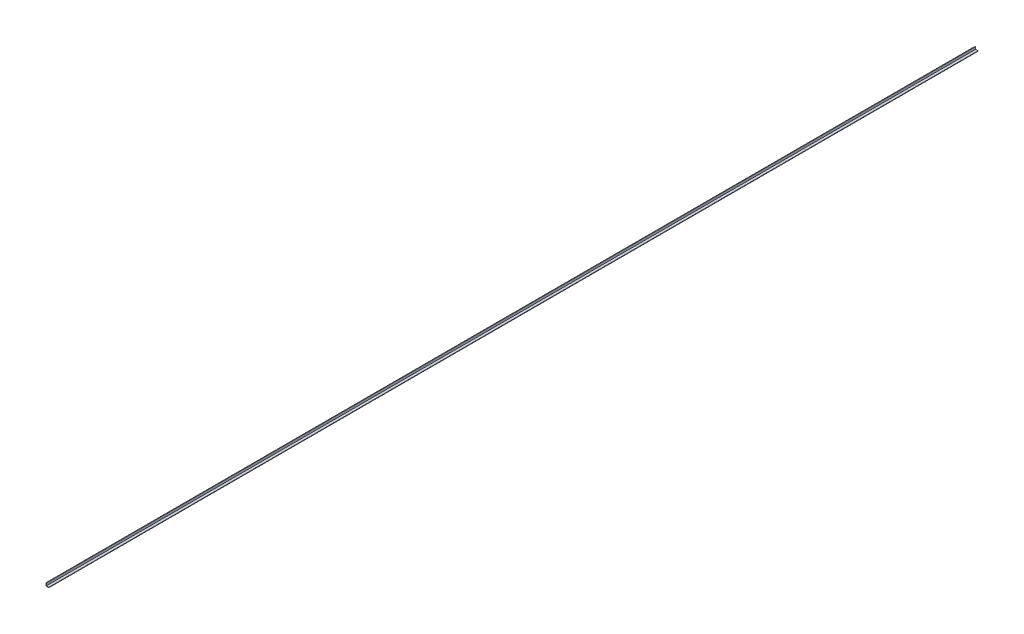
ISO-10303-21;
HEADER;
FILE_DESCRIPTION(('STEP AP214'),'2;1');
FILE_NAME('part.step','',(''),(''),'','','');
FILE_SCHEMA(('AUTOMOTIVE_DESIGN { 1 0 10303 214 1 1 1 1 }'));
ENDSEC;
DATA;
#1=APPLICATION_CONTEXT('core data for automotive mechanical design processes');
#2=APPLICATION_PROTOCOL_DEFINITION('international standard','automotive_design',2000,#1);
#3=PRODUCT_CONTEXT('',#1,'mechanical');
#4=PRODUCT('Part','Part','',(#3));
#5=PRODUCT_RELATED_PRODUCT_CATEGORY('part','',(#4));
#6=PRODUCT_DEFINITION_FORMATION('','',#4);
#7=PRODUCT_DEFINITION_CONTEXT('part definition',#1,'design');
#8=PRODUCT_DEFINITION('design','',#6,#7);
#9=PRODUCT_DEFINITION_SHAPE('','',#8);
#10=(LENGTH_UNIT() NAMED_UNIT(*) SI_UNIT(.MILLI.,.METRE.));
#11=(NAMED_UNIT(*) PLANE_ANGLE_UNIT() SI_UNIT($,.RADIAN.));
#12=(NAMED_UNIT(*) SI_UNIT($,.STERADIAN.) SOLID_ANGLE_UNIT());
#13=UNCERTAINTY_MEASURE_WITH_UNIT(LENGTH_MEASURE(1.E-05),#10,'distance_accuracy_value','');
#14=(GEOMETRIC_REPRESENTATION_CONTEXT(3) GLOBAL_UNCERTAINTY_ASSIGNED_CONTEXT((#13)) GLOBAL_UNIT_ASSIGNED_CONTEXT((#10,
#11,#12)) REPRESENTATION_CONTEXT('',''));
#15=CARTESIAN_POINT('',(0.,0.,0.));
#16=DIRECTION('',(0.,0.,1.));
#17=DIRECTION('',(1.,0.,0.));
#18=AXIS2_PLACEMENT_3D('',#15,#16,#17);
#19=CARTESIAN_POINT('',(3.18,19.05,-6100.));
#20=DIRECTION('',(0.,1.,0.));
#21=DIRECTION('',(0.,0.,1.));
#22=AXIS2_PLACEMENT_3D('',#19,#20,#21);
#23=PLANE('',#22);
#24=DIRECTION('',(-1.,0.,0.));
#25=VECTOR('',#24,1.);
#26=CARTESIAN_POINT('',(3.18,19.05,0.));
#27=LINE('',#26,#25);
#28=CARTESIAN_POINT('',(3.18,19.05,0.));
#29=VERTEX_POINT('',#28);
#30=CARTESIAN_POINT('',(0.,19.05,0.));
#31=VERTEX_POINT('',#30);
#32=EDGE_CURVE('E118',#29,#31,#27,.T.);
#33=ORIENTED_EDGE('',*,*,#32,.F.);
#34=DIRECTION('',(0.,0.,1.));
#35=VECTOR('',#34,1.);
#36=CARTESIAN_POINT('',(3.18,19.05,-6100.));
#37=LINE('',#36,#35);
#38=CARTESIAN_POINT('',(3.18,19.05,-6100.));
#39=VERTEX_POINT('',#38);
#40=EDGE_CURVE('E11',#39,#29,#37,.T.);
#41=ORIENTED_EDGE('',*,*,#40,.F.);
#42=DIRECTION('',(-1.,0.,0.));
#43=VECTOR('',#42,1.);
#44=CARTESIAN_POINT('',(3.18,19.05,-6100.));
#45=LINE('',#44,#43);
#46=CARTESIAN_POINT('',(0.,19.05,-6100.));
#47=VERTEX_POINT('',#46);
#48=EDGE_CURVE('E132',#39,#47,#45,.T.);
#49=ORIENTED_EDGE('',*,*,#48,.T.);
#50=DIRECTION('',(0.,0.,1.));
#51=VECTOR('',#50,1.);
#52=CARTESIAN_POINT('',(0.,19.05,-6100.));
#53=LINE('',#52,#51);
#54=EDGE_CURVE('E36',#47,#31,#53,.T.);
#55=ORIENTED_EDGE('',*,*,#54,.T.);
#56=EDGE_LOOP('',(#33,#41,#49,#55));
#57=FACE_BOUND('',#56,.T.);
#58=ADVANCED_FACE('F33',(#57),#23,.T.);
#59=CARTESIAN_POINT('',(3.18,3.18,-6100.));
#60=DIRECTION('',(1.,0.,0.));
#61=DIRECTION('',(0.,0.,-1.));
#62=AXIS2_PLACEMENT_3D('',#59,#60,#61);
#63=PLANE('',#62);
#64=DIRECTION('',(0.,1.,0.));
#65=VECTOR('',#64,1.);
#66=CARTESIAN_POINT('',(3.18,3.18,0.));
#67=LINE('',#66,#65);
#68=CARTESIAN_POINT('',(3.18,3.18,0.));
#69=VERTEX_POINT('',#68);
#70=EDGE_CURVE('E130',#69,#29,#67,.T.);
#71=ORIENTED_EDGE('',*,*,#70,.F.);
#72=DIRECTION('',(0.,0.,1.));
#73=VECTOR('',#72,1.);
#74=CARTESIAN_POINT('',(3.18,3.18,-6100.));
#75=LINE('',#74,#73);
#76=CARTESIAN_POINT('',(3.18,3.18,-6100.));
#77=VERTEX_POINT('',#76);
#78=EDGE_CURVE('E42',#77,#69,#75,.T.);
#79=ORIENTED_EDGE('',*,*,#78,.F.);
#80=DIRECTION('',(0.,1.,0.));
#81=VECTOR('',#80,1.);
#82=CARTESIAN_POINT('',(3.18,3.18,-6100.));
#83=LINE('',#82,#81);
#84=EDGE_CURVE('E108',#77,#39,#83,.T.);
#85=ORIENTED_EDGE('',*,*,#84,.T.);
#86=ORIENTED_EDGE('',*,*,#40,.T.);
#87=EDGE_LOOP('',(#71,#79,#85,#86));
#88=FACE_BOUND('',#87,.T.);
#89=ADVANCED_FACE('F140',(#88),#63,.T.);
#90=CARTESIAN_POINT('',(19.05,3.18,-6100.));
#91=DIRECTION('',(0.,1.,0.));
#92=DIRECTION('',(-1.,0.,0.));
#93=AXIS2_PLACEMENT_3D('',#90,#91,#92);
#94=PLANE('',#93);
#95=DIRECTION('',(-1.,0.,0.));
#96=VECTOR('',#95,1.);
#97=CARTESIAN_POINT('',(19.05,3.18,0.));
#98=LINE('',#97,#96);
#99=CARTESIAN_POINT('',(19.05,3.18,0.));
#100=VERTEX_POINT('',#99);
#101=EDGE_CURVE('E95',#100,#69,#98,.T.);
#102=ORIENTED_EDGE('',*,*,#101,.F.);
#103=DIRECTION('',(0.,0.,1.));
#104=VECTOR('',#103,1.);
#105=CARTESIAN_POINT('',(19.05,3.18,-6100.));
#106=LINE('',#105,#104);
#107=CARTESIAN_POINT('',(19.05,3.18,-6100.));
#108=VERTEX_POINT('',#107);
#109=EDGE_CURVE('E90',#108,#100,#106,.T.);
#110=ORIENTED_EDGE('',*,*,#109,.F.);
#111=DIRECTION('',(-1.,0.,0.));
#112=VECTOR('',#111,1.);
#113=CARTESIAN_POINT('',(19.05,3.18,-6100.));
#114=LINE('',#113,#112);
#115=EDGE_CURVE('E93',#108,#77,#114,.T.);
#116=ORIENTED_EDGE('',*,*,#115,.T.);
#117=ORIENTED_EDGE('',*,*,#78,.T.);
#118=EDGE_LOOP('',(#102,#110,#116,#117));
#119=FACE_BOUND('',#118,.T.);
#120=ADVANCED_FACE('F92',(#119),#94,.T.);
#121=CARTESIAN_POINT('',(19.05,0.,-6100.));
#122=DIRECTION('',(1.,0.,0.));
#123=DIRECTION('',(0.,0.,-1.));
#124=AXIS2_PLACEMENT_3D('',#121,#122,#123);
#125=PLANE('',#124);
#126=DIRECTION('',(0.,1.,0.));
#127=VECTOR('',#126,1.);
#128=CARTESIAN_POINT('',(19.05,0.,0.));
#129=LINE('',#128,#127);
#130=CARTESIAN_POINT('',(19.05,0.,0.));
#131=VERTEX_POINT('',#130);
#132=EDGE_CURVE('E127',#131,#100,#129,.T.);
#133=ORIENTED_EDGE('',*,*,#132,.F.);
#134=DIRECTION('',(0.,0.,1.));
#135=VECTOR('',#134,1.);
#136=CARTESIAN_POINT('',(19.05,0.,-6100.));
#137=LINE('',#136,#135);
#138=CARTESIAN_POINT('',(19.05,0.,-6100.));
#139=VERTEX_POINT('',#138);
#140=EDGE_CURVE('E100',#139,#131,#137,.T.);
#141=ORIENTED_EDGE('',*,*,#140,.F.);
#142=DIRECTION('',(0.,1.,0.));
#143=VECTOR('',#142,1.);
#144=CARTESIAN_POINT('',(19.05,0.,-6100.));
#145=LINE('',#144,#143);
#146=EDGE_CURVE('E106',#139,#108,#145,.T.);
#147=ORIENTED_EDGE('',*,*,#146,.T.);
#148=ORIENTED_EDGE('',*,*,#109,.T.);
#149=EDGE_LOOP('',(#133,#141,#147,#148));
#150=FACE_BOUND('',#149,.T.);
#151=ADVANCED_FACE('F110',(#150),#125,.T.);
#152=CARTESIAN_POINT('',(0.,0.,-6100.));
#153=DIRECTION('',(0.,-1.,0.));
#154=DIRECTION('',(0.,0.,-1.));
#155=AXIS2_PLACEMENT_3D('',#152,#153,#154);
#156=PLANE('',#155);
#157=DIRECTION('',(1.,0.,0.));
#158=VECTOR('',#157,1.);
#159=CARTESIAN_POINT('',(0.,0.,0.));
#160=LINE('',#159,#158);
#161=CARTESIAN_POINT('',(0.,0.,0.));
#162=VERTEX_POINT('',#161);
#163=EDGE_CURVE('E124',#162,#131,#160,.T.);
#164=ORIENTED_EDGE('',*,*,#163,.F.);
#165=DIRECTION('',(0.,0.,1.));
#166=VECTOR('',#165,1.);
#167=CARTESIAN_POINT('',(0.,0.,-6100.));
#168=LINE('',#167,#166);
#169=CARTESIAN_POINT('',(0.,0.,-6100.));
#170=VERTEX_POINT('',#169);
#171=EDGE_CURVE('E135',#170,#162,#168,.T.);
#172=ORIENTED_EDGE('',*,*,#171,.F.);
#173=DIRECTION('',(1.,0.,0.));
#174=VECTOR('',#173,1.);
#175=CARTESIAN_POINT('',(0.,0.,-6100.));
#176=LINE('',#175,#174);
#177=EDGE_CURVE('E111',#170,#139,#176,.T.);
#178=ORIENTED_EDGE('',*,*,#177,.T.);
#179=ORIENTED_EDGE('',*,*,#140,.T.);
#180=EDGE_LOOP('',(#164,#172,#178,#179));
#181=FACE_BOUND('',#180,.T.);
#182=ADVANCED_FACE('F153',(#181),#156,.T.);
#183=CARTESIAN_POINT('',(0.,19.05,-6100.));
#184=DIRECTION('',(-1.,0.,0.));
#185=DIRECTION('',(0.,-1.,0.));
#186=AXIS2_PLACEMENT_3D('',#183,#184,#185);
#187=PLANE('',#186);
#188=DIRECTION('',(0.,-1.,0.));
#189=VECTOR('',#188,1.);
#190=CARTESIAN_POINT('',(0.,19.05,0.));
#191=LINE('',#190,#189);
#192=EDGE_CURVE('E121',#31,#162,#191,.T.);
#193=ORIENTED_EDGE('',*,*,#192,.F.);
#194=ORIENTED_EDGE('',*,*,#54,.F.);
#195=DIRECTION('',(0.,-1.,0.));
#196=VECTOR('',#195,1.);
#197=CARTESIAN_POINT('',(0.,19.05,-6100.));
#198=LINE('',#197,#196);
#199=EDGE_CURVE('E113',#47,#170,#198,.T.);
#200=ORIENTED_EDGE('',*,*,#199,.T.);
#201=ORIENTED_EDGE('',*,*,#171,.T.);
#202=EDGE_LOOP('',(#193,#194,#200,#201));
#203=FACE_BOUND('',#202,.T.);
#204=ADVANCED_FACE('F137',(#203),#187,.T.);
#205=CARTESIAN_POINT('',(0.,0.,-6100.));
#206=DIRECTION('',(0.,0.,1.));
#207=DIRECTION('',(1.,0.,0.));
#208=AXIS2_PLACEMENT_3D('',#205,#206,#207);
#209=PLANE('',#208);
#210=ORIENTED_EDGE('',*,*,#48,.F.);
#211=ORIENTED_EDGE('',*,*,#84,.F.);
#212=ORIENTED_EDGE('',*,*,#115,.F.);
#213=ORIENTED_EDGE('',*,*,#146,.F.);
#214=ORIENTED_EDGE('',*,*,#177,.F.);
#215=ORIENTED_EDGE('',*,*,#199,.F.);
#216=EDGE_LOOP('',(#210,#211,#212,#213,#214,#215));
#217=FACE_BOUND('',#216,.T.);
#218=ADVANCED_FACE('F104',(#217),#209,.F.);
#219=CARTESIAN_POINT('',(0.,0.,0.));
#220=DIRECTION('',(0.,0.,1.));
#221=DIRECTION('',(1.,0.,0.));
#222=AXIS2_PLACEMENT_3D('',#219,#220,#221);
#223=PLANE('',#222);
#224=ORIENTED_EDGE('',*,*,#32,.T.);
#225=ORIENTED_EDGE('',*,*,#192,.T.);
#226=ORIENTED_EDGE('',*,*,#163,.T.);
#227=ORIENTED_EDGE('',*,*,#132,.T.);
#228=ORIENTED_EDGE('',*,*,#101,.T.);
#229=ORIENTED_EDGE('',*,*,#70,.T.);
#230=EDGE_LOOP('',(#224,#225,#226,#227,#228,#229));
#231=FACE_BOUND('',#230,.T.);
#232=ADVANCED_FACE('F139',(#231),#223,.T.);
#233=CLOSED_SHELL('',(#58,#89,#120,#151,#182,#204,#218,#232));
#234=MANIFOLD_SOLID_BREP('B2',#233);
#235=ADVANCED_BREP_SHAPE_REPRESENTATION('',(#18,#234),#14);
#236=SHAPE_DEFINITION_REPRESENTATION(#9,#235);
ENDSEC;
END-ISO-10303-21;
